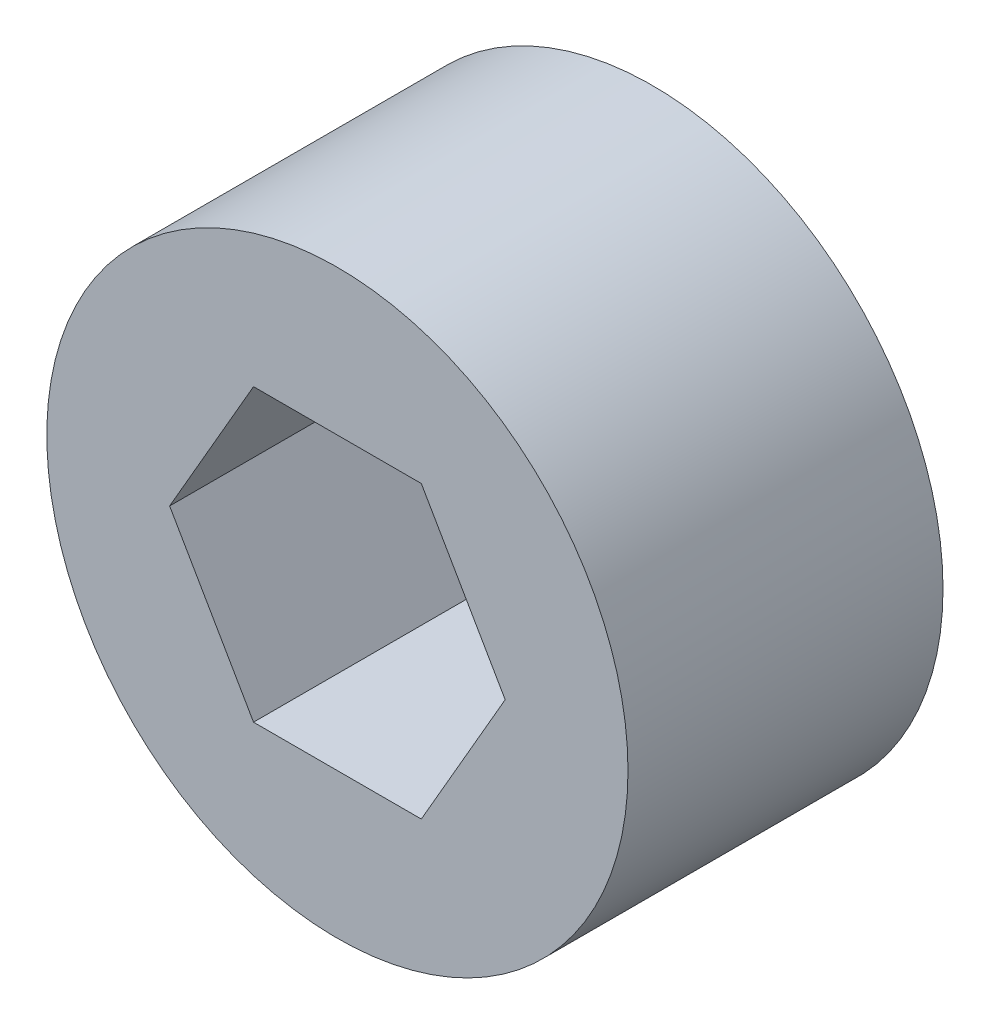
ISO-10303-21;
HEADER;
FILE_DESCRIPTION(('STEP AP214'),'2;1');
FILE_NAME('part.step','',(''),(''),'','','');
FILE_SCHEMA(('AUTOMOTIVE_DESIGN { 1 0 10303 214 1 1 1 1 }'));
ENDSEC;
DATA;
#1=APPLICATION_CONTEXT('core data for automotive mechanical design processes');
#2=APPLICATION_PROTOCOL_DEFINITION('international standard','automotive_design',2000,#1);
#3=PRODUCT_CONTEXT('',#1,'mechanical');
#4=PRODUCT('Part','Part','',(#3));
#5=PRODUCT_RELATED_PRODUCT_CATEGORY('part','',(#4));
#6=PRODUCT_DEFINITION_FORMATION('','',#4);
#7=PRODUCT_DEFINITION_CONTEXT('part definition',#1,'design');
#8=PRODUCT_DEFINITION('design','',#6,#7);
#9=PRODUCT_DEFINITION_SHAPE('','',#8);
#10=(LENGTH_UNIT() NAMED_UNIT(*) SI_UNIT(.MILLI.,.METRE.));
#11=(NAMED_UNIT(*) PLANE_ANGLE_UNIT() SI_UNIT($,.RADIAN.));
#12=(NAMED_UNIT(*) SI_UNIT($,.STERADIAN.) SOLID_ANGLE_UNIT());
#13=UNCERTAINTY_MEASURE_WITH_UNIT(LENGTH_MEASURE(1.E-05),#10,'distance_accuracy_value','');
#14=(GEOMETRIC_REPRESENTATION_CONTEXT(3) GLOBAL_UNCERTAINTY_ASSIGNED_CONTEXT((#13)) GLOBAL_UNIT_ASSIGNED_CONTEXT((#10,
#11,#12)) REPRESENTATION_CONTEXT('',''));
#15=CARTESIAN_POINT('',(0.,0.,0.));
#16=DIRECTION('',(0.,0.,1.));
#17=DIRECTION('',(1.,0.,0.));
#18=AXIS2_PLACEMENT_3D('',#15,#16,#17);
#19=CARTESIAN_POINT('',(0.,0.,6.8834));
#20=DIRECTION('',(0.,0.,1.));
#21=DIRECTION('',(1.,0.,0.));
#22=AXIS2_PLACEMENT_3D('',#19,#20,#21);
#23=PLANE('',#22);
#24=CARTESIAN_POINT('',(0.,0.,6.8834));
#25=DIRECTION('',(0.,0.,1.));
#26=DIRECTION('',(1.,0.,0.));
#27=AXIS2_PLACEMENT_3D('',#24,#25,#26);
#28=CIRCLE('',#27,12.7);
#29=CARTESIAN_POINT('',(12.7,0.,6.8834));
#30=VERTEX_POINT('',#29);
#31=EDGE_CURVE('E11',#30,#30,#28,.T.);
#32=ORIENTED_EDGE('',*,*,#31,.T.);
#33=EDGE_LOOP('',(#32));
#34=FACE_BOUND('',#33,.T.);
#35=DIRECTION('',(0.5,-0.866025403784439,0.));
#36=VECTOR('',#35,1.);
#37=CARTESIAN_POINT('',(-7.33234841870825,0.,6.8834));
#38=LINE('',#37,#36);
#39=CARTESIAN_POINT('',(-7.33234841870825,0.,6.8834));
#40=VERTEX_POINT('',#39);
#41=CARTESIAN_POINT('',(-3.66617420935412,-6.35,6.8834));
#42=VERTEX_POINT('',#41);
#43=EDGE_CURVE('E93',#40,#42,#38,.T.);
#44=ORIENTED_EDGE('',*,*,#43,.F.);
#45=DIRECTION('',(-0.5,-0.866025403784439,0.));
#46=VECTOR('',#45,1.);
#47=CARTESIAN_POINT('',(-3.66617420935413,6.34999999999999,6.8834));
#48=LINE('',#47,#46);
#49=CARTESIAN_POINT('',(-3.66617420935413,6.34999999999999,6.8834));
#50=VERTEX_POINT('',#49);
#51=EDGE_CURVE('E85',#50,#40,#48,.T.);
#52=ORIENTED_EDGE('',*,*,#51,.F.);
#53=DIRECTION('',(-1.,0.,0.));
#54=VECTOR('',#53,1.);
#55=CARTESIAN_POINT('',(3.66617420935412,6.35,6.8834));
#56=LINE('',#55,#54);
#57=CARTESIAN_POINT('',(3.66617420935412,6.35,6.8834));
#58=VERTEX_POINT('',#57);
#59=EDGE_CURVE('E113',#58,#50,#56,.T.);
#60=ORIENTED_EDGE('',*,*,#59,.F.);
#61=DIRECTION('',(-0.5,0.866025403784439,0.));
#62=VECTOR('',#61,1.);
#63=CARTESIAN_POINT('',(7.33234841870824,0.,6.8834));
#64=LINE('',#63,#62);
#65=CARTESIAN_POINT('',(7.33234841870824,0.,6.8834));
#66=VERTEX_POINT('',#65);
#67=EDGE_CURVE('E111',#66,#58,#64,.T.);
#68=ORIENTED_EDGE('',*,*,#67,.F.);
#69=DIRECTION('',(0.5,0.866025403784439,0.));
#70=VECTOR('',#69,1.);
#71=CARTESIAN_POINT('',(3.66617420935412,-6.35,6.8834));
#72=LINE('',#71,#70);
#73=CARTESIAN_POINT('',(3.66617420935412,-6.35,6.8834));
#74=VERTEX_POINT('',#73);
#75=EDGE_CURVE('E107',#74,#66,#72,.T.);
#76=ORIENTED_EDGE('',*,*,#75,.F.);
#77=DIRECTION('',(1.,0.,0.));
#78=VECTOR('',#77,1.);
#79=CARTESIAN_POINT('',(-3.66617420935412,-6.35,6.8834));
#80=LINE('',#79,#78);
#81=EDGE_CURVE('E105',#42,#74,#80,.T.);
#82=ORIENTED_EDGE('',*,*,#81,.F.);
#83=EDGE_LOOP('',(#44,#52,#60,#68,#76,#82));
#84=FACE_BOUND('',#83,.T.);
#85=ADVANCED_FACE('F32',(#34,#84),#23,.T.);
#86=CARTESIAN_POINT('',(0.,0.,-6.8834));
#87=DIRECTION('',(0.,0.,1.));
#88=DIRECTION('',(1.,0.,0.));
#89=AXIS2_PLACEMENT_3D('',#86,#87,#88);
#90=PLANE('',#89);
#91=CARTESIAN_POINT('',(0.,0.,-6.8834));
#92=DIRECTION('',(0.,0.,1.));
#93=DIRECTION('',(1.,0.,0.));
#94=AXIS2_PLACEMENT_3D('',#91,#92,#93);
#95=CIRCLE('',#94,12.7);
#96=CARTESIAN_POINT('',(12.7,0.,-6.8834));
#97=VERTEX_POINT('',#96);
#98=EDGE_CURVE('E36',#97,#97,#95,.T.);
#99=ORIENTED_EDGE('',*,*,#98,.F.);
#100=EDGE_LOOP('',(#99));
#101=FACE_BOUND('',#100,.T.);
#102=DIRECTION('',(-0.5,-0.866025403784439,0.));
#103=VECTOR('',#102,1.);
#104=CARTESIAN_POINT('',(-3.66617420935413,6.34999999999999,-6.8834));
#105=LINE('',#104,#103);
#106=CARTESIAN_POINT('',(-3.66617420935413,6.34999999999999,-6.8834));
#107=VERTEX_POINT('',#106);
#108=CARTESIAN_POINT('',(-7.33234841870825,0.,-6.8834));
#109=VERTEX_POINT('',#108);
#110=EDGE_CURVE('E55',#107,#109,#105,.T.);
#111=ORIENTED_EDGE('',*,*,#110,.T.);
#112=DIRECTION('',(0.5,-0.866025403784439,0.));
#113=VECTOR('',#112,1.);
#114=CARTESIAN_POINT('',(-7.33234841870825,0.,-6.8834));
#115=LINE('',#114,#113);
#116=CARTESIAN_POINT('',(-3.66617420935412,-6.35,-6.8834));
#117=VERTEX_POINT('',#116);
#118=EDGE_CURVE('E100',#109,#117,#115,.T.);
#119=ORIENTED_EDGE('',*,*,#118,.T.);
#120=DIRECTION('',(1.,0.,0.));
#121=VECTOR('',#120,1.);
#122=CARTESIAN_POINT('',(-3.66617420935412,-6.35,-6.8834));
#123=LINE('',#122,#121);
#124=CARTESIAN_POINT('',(3.66617420935412,-6.35,-6.8834));
#125=VERTEX_POINT('',#124);
#126=EDGE_CURVE('E117',#117,#125,#123,.T.);
#127=ORIENTED_EDGE('',*,*,#126,.T.);
#128=DIRECTION('',(0.5,0.866025403784439,0.));
#129=VECTOR('',#128,1.);
#130=CARTESIAN_POINT('',(3.66617420935412,-6.35,-6.8834));
#131=LINE('',#130,#129);
#132=CARTESIAN_POINT('',(7.33234841870824,0.,-6.8834));
#133=VERTEX_POINT('',#132);
#134=EDGE_CURVE('E120',#125,#133,#131,.T.);
#135=ORIENTED_EDGE('',*,*,#134,.T.);
#136=DIRECTION('',(-0.5,0.866025403784439,0.));
#137=VECTOR('',#136,1.);
#138=CARTESIAN_POINT('',(7.33234841870824,0.,-6.8834));
#139=LINE('',#138,#137);
#140=CARTESIAN_POINT('',(3.66617420935412,6.35,-6.8834));
#141=VERTEX_POINT('',#140);
#142=EDGE_CURVE('E123',#133,#141,#139,.T.);
#143=ORIENTED_EDGE('',*,*,#142,.T.);
#144=DIRECTION('',(-1.,0.,0.));
#145=VECTOR('',#144,1.);
#146=CARTESIAN_POINT('',(3.66617420935412,6.35,-6.8834));
#147=LINE('',#146,#145);
#148=EDGE_CURVE('E94',#141,#107,#147,.T.);
#149=ORIENTED_EDGE('',*,*,#148,.T.);
#150=EDGE_LOOP('',(#111,#119,#127,#135,#143,#149));
#151=FACE_BOUND('',#150,.T.);
#152=ADVANCED_FACE('F140',(#101,#151),#90,.F.);
#153=CARTESIAN_POINT('',(0.,0.,6.8834));
#154=DIRECTION('',(0.,0.,-1.));
#155=DIRECTION('',(-1.,0.,0.));
#156=AXIS2_PLACEMENT_3D('',#153,#154,#155);
#157=CYLINDRICAL_SURFACE('',#156,12.7);
#158=ORIENTED_EDGE('',*,*,#31,.F.);
#159=EDGE_LOOP('',(#158));
#160=FACE_BOUND('',#159,.T.);
#161=ORIENTED_EDGE('',*,*,#98,.T.);
#162=EDGE_LOOP('',(#161));
#163=FACE_BOUND('',#162,.T.);
#164=ADVANCED_FACE('F34',(#160,#163),#157,.T.);
#165=CARTESIAN_POINT('',(-3.66617420935413,6.34999999999999,6.8834));
#166=DIRECTION('',(0.866025403784439,-0.5,0.));
#167=DIRECTION('',(0.5,0.866025403784439,0.));
#168=AXIS2_PLACEMENT_3D('',#165,#166,#167);
#169=PLANE('',#168);
#170=ORIENTED_EDGE('',*,*,#110,.F.);
#171=DIRECTION('',(0.,0.,-1.));
#172=VECTOR('',#171,1.);
#173=CARTESIAN_POINT('',(-3.66617420935413,6.34999999999999,6.8834));
#174=LINE('',#173,#172);
#175=EDGE_CURVE('E89',#50,#107,#174,.T.);
#176=ORIENTED_EDGE('',*,*,#175,.F.);
#177=ORIENTED_EDGE('',*,*,#51,.T.);
#178=DIRECTION('',(0.,0.,-1.));
#179=VECTOR('',#178,1.);
#180=CARTESIAN_POINT('',(-7.33234841870825,0.,6.8834));
#181=LINE('',#180,#179);
#182=EDGE_CURVE('E88',#40,#109,#181,.T.);
#183=ORIENTED_EDGE('',*,*,#182,.T.);
#184=EDGE_LOOP('',(#170,#176,#177,#183));
#185=FACE_BOUND('',#184,.T.);
#186=ADVANCED_FACE('F87',(#185),#169,.T.);
#187=CARTESIAN_POINT('',(-7.33234841870825,0.,6.8834));
#188=DIRECTION('',(0.866025403784439,0.5,0.));
#189=DIRECTION('',(-0.5,0.866025403784439,0.));
#190=AXIS2_PLACEMENT_3D('',#187,#188,#189);
#191=PLANE('',#190);
#192=ORIENTED_EDGE('',*,*,#118,.F.);
#193=ORIENTED_EDGE('',*,*,#182,.F.);
#194=ORIENTED_EDGE('',*,*,#43,.T.);
#195=DIRECTION('',(0.,0.,-1.));
#196=VECTOR('',#195,1.);
#197=CARTESIAN_POINT('',(-3.66617420935412,-6.35,6.8834));
#198=LINE('',#197,#196);
#199=EDGE_CURVE('E101',#42,#117,#198,.T.);
#200=ORIENTED_EDGE('',*,*,#199,.T.);
#201=EDGE_LOOP('',(#192,#193,#194,#200));
#202=FACE_BOUND('',#201,.T.);
#203=ADVANCED_FACE('F97',(#202),#191,.T.);
#204=CARTESIAN_POINT('',(-3.66617420935412,-6.35,6.8834));
#205=DIRECTION('',(0.,1.,0.));
#206=DIRECTION('',(-1.,0.,0.));
#207=AXIS2_PLACEMENT_3D('',#204,#205,#206);
#208=PLANE('',#207);
#209=ORIENTED_EDGE('',*,*,#126,.F.);
#210=ORIENTED_EDGE('',*,*,#199,.F.);
#211=ORIENTED_EDGE('',*,*,#81,.T.);
#212=DIRECTION('',(0.,0.,-1.));
#213=VECTOR('',#212,1.);
#214=CARTESIAN_POINT('',(3.66617420935412,-6.35,6.8834));
#215=LINE('',#214,#213);
#216=EDGE_CURVE('E132',#74,#125,#215,.T.);
#217=ORIENTED_EDGE('',*,*,#216,.T.);
#218=EDGE_LOOP('',(#209,#210,#211,#217));
#219=FACE_BOUND('',#218,.T.);
#220=ADVANCED_FACE('F136',(#219),#208,.T.);
#221=CARTESIAN_POINT('',(3.66617420935412,-6.35,6.8834));
#222=DIRECTION('',(-0.866025403784439,0.5,0.));
#223=DIRECTION('',(-0.5,-0.866025403784439,0.));
#224=AXIS2_PLACEMENT_3D('',#221,#222,#223);
#225=PLANE('',#224);
#226=ORIENTED_EDGE('',*,*,#134,.F.);
#227=ORIENTED_EDGE('',*,*,#216,.F.);
#228=ORIENTED_EDGE('',*,*,#75,.T.);
#229=DIRECTION('',(0.,0.,-1.));
#230=VECTOR('',#229,1.);
#231=CARTESIAN_POINT('',(7.33234841870824,0.,6.8834));
#232=LINE('',#231,#230);
#233=EDGE_CURVE('E130',#66,#133,#232,.T.);
#234=ORIENTED_EDGE('',*,*,#233,.T.);
#235=EDGE_LOOP('',(#226,#227,#228,#234));
#236=FACE_BOUND('',#235,.T.);
#237=ADVANCED_FACE('F148',(#236),#225,.T.);
#238=CARTESIAN_POINT('',(7.33234841870824,0.,6.8834));
#239=DIRECTION('',(-0.866025403784439,-0.5,0.));
#240=DIRECTION('',(0.5,-0.866025403784439,0.));
#241=AXIS2_PLACEMENT_3D('',#238,#239,#240);
#242=PLANE('',#241);
#243=ORIENTED_EDGE('',*,*,#142,.F.);
#244=ORIENTED_EDGE('',*,*,#233,.F.);
#245=ORIENTED_EDGE('',*,*,#67,.T.);
#246=DIRECTION('',(0.,0.,-1.));
#247=VECTOR('',#246,1.);
#248=CARTESIAN_POINT('',(3.66617420935412,6.35,6.8834));
#249=LINE('',#248,#247);
#250=EDGE_CURVE('E47',#58,#141,#249,.T.);
#251=ORIENTED_EDGE('',*,*,#250,.T.);
#252=EDGE_LOOP('',(#243,#244,#245,#251));
#253=FACE_BOUND('',#252,.T.);
#254=ADVANCED_FACE('F146',(#253),#242,.T.);
#255=CARTESIAN_POINT('',(3.66617420935412,6.35,6.8834));
#256=DIRECTION('',(0.,-1.,0.));
#257=DIRECTION('',(1.,0.,0.));
#258=AXIS2_PLACEMENT_3D('',#255,#256,#257);
#259=PLANE('',#258);
#260=ORIENTED_EDGE('',*,*,#148,.F.);
#261=ORIENTED_EDGE('',*,*,#250,.F.);
#262=ORIENTED_EDGE('',*,*,#59,.T.);
#263=ORIENTED_EDGE('',*,*,#175,.T.);
#264=EDGE_LOOP('',(#260,#261,#262,#263));
#265=FACE_BOUND('',#264,.T.);
#266=ADVANCED_FACE('F142',(#265),#259,.T.);
#267=CLOSED_SHELL('',(#85,#152,#164,#186,#203,#220,#237,#254,#266));
#268=MANIFOLD_SOLID_BREP('B2',#267);
#269=ADVANCED_BREP_SHAPE_REPRESENTATION('',(#18,#268),#14);
#270=SHAPE_DEFINITION_REPRESENTATION(#9,#269);
ENDSEC;
END-ISO-10303-21;
